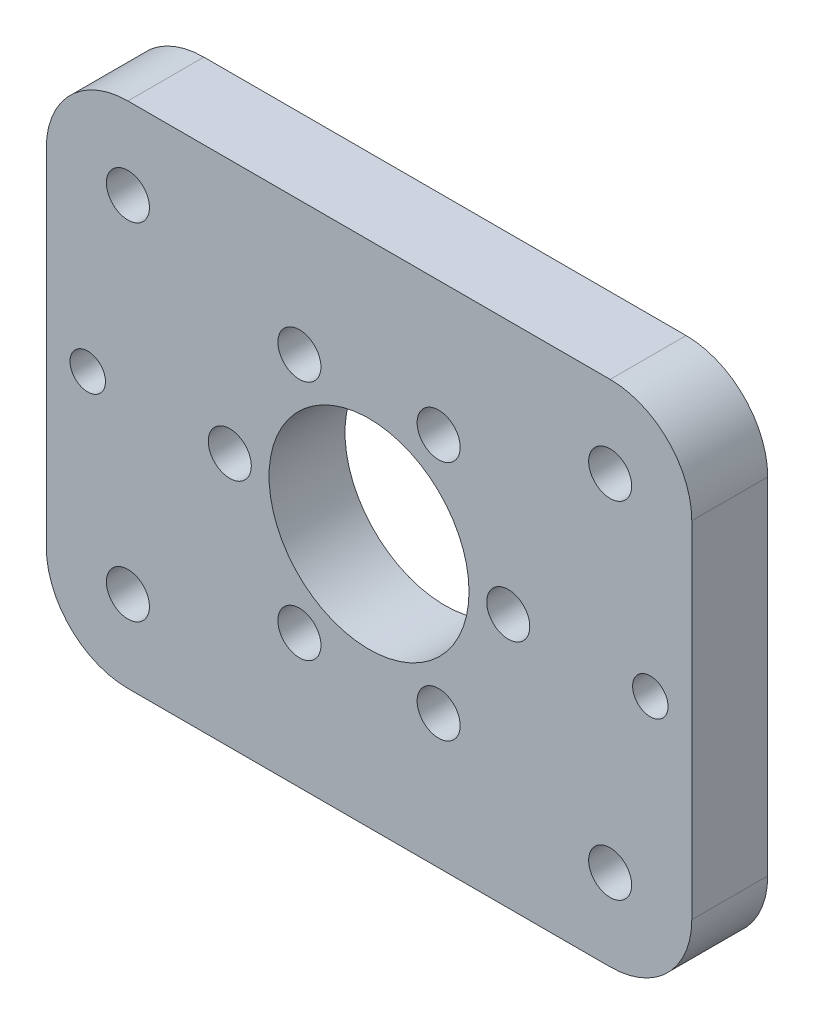
ISO-10303-21;
HEADER;
FILE_DESCRIPTION(('STEP AP214'),'2;1');
FILE_NAME('part.step','',(''),(''),'','','');
FILE_SCHEMA(('AUTOMOTIVE_DESIGN { 1 0 10303 214 1 1 1 1 }'));
ENDSEC;
DATA;
#1=APPLICATION_CONTEXT('core data for automotive mechanical design processes');
#2=APPLICATION_PROTOCOL_DEFINITION('international standard','automotive_design',2000,#1);
#3=PRODUCT_CONTEXT('',#1,'mechanical');
#4=PRODUCT('Part','Part','',(#3));
#5=PRODUCT_RELATED_PRODUCT_CATEGORY('part','',(#4));
#6=PRODUCT_DEFINITION_FORMATION('','',#4);
#7=PRODUCT_DEFINITION_CONTEXT('part definition',#1,'design');
#8=PRODUCT_DEFINITION('design','',#6,#7);
#9=PRODUCT_DEFINITION_SHAPE('','',#8);
#10=(LENGTH_UNIT() NAMED_UNIT(*) SI_UNIT(.MILLI.,.METRE.));
#11=(NAMED_UNIT(*) PLANE_ANGLE_UNIT() SI_UNIT($,.RADIAN.));
#12=(NAMED_UNIT(*) SI_UNIT($,.STERADIAN.) SOLID_ANGLE_UNIT());
#13=UNCERTAINTY_MEASURE_WITH_UNIT(LENGTH_MEASURE(1.E-05),#10,'distance_accuracy_value','');
#14=(GEOMETRIC_REPRESENTATION_CONTEXT(3) GLOBAL_UNCERTAINTY_ASSIGNED_CONTEXT((#13)) GLOBAL_UNIT_ASSIGNED_CONTEXT((#10,
#11,#12)) REPRESENTATION_CONTEXT('',''));
#15=CARTESIAN_POINT('',(0.,0.,0.));
#16=DIRECTION('',(0.,0.,1.));
#17=DIRECTION('',(1.,0.,0.));
#18=AXIS2_PLACEMENT_3D('',#15,#16,#17);
#19=CARTESIAN_POINT('',(-25.4,-20.,6.));
#20=DIRECTION('',(0.,0.,1.));
#21=DIRECTION('',(1.,0.,0.));
#22=AXIS2_PLACEMENT_3D('',#19,#20,#21);
#23=PLANE('',#22);
#24=CARTESIAN_POINT('',(5.50000000000001,9.52627944162883,6.));
#25=DIRECTION('',(0.,0.,1.));
#26=DIRECTION('',(1.,0.,0.));
#27=AXIS2_PLACEMENT_3D('',#24,#25,#26);
#28=CIRCLE('',#27,1.7);
#29=CARTESIAN_POINT('',(7.2,9.52627944162883,6.));
#30=VERTEX_POINT('',#29);
#31=EDGE_CURVE('E164',#30,#30,#28,.T.);
#32=ORIENTED_EDGE('',*,*,#31,.F.);
#33=EDGE_LOOP('',(#32));
#34=FACE_BOUND('',#33,.T.);
#35=CARTESIAN_POINT('',(-5.50000000000001,9.52627944162883,6.));
#36=DIRECTION('',(0.,0.,1.));
#37=DIRECTION('',(1.,0.,0.));
#38=AXIS2_PLACEMENT_3D('',#35,#36,#37);
#39=CIRCLE('',#38,1.7);
#40=CARTESIAN_POINT('',(-3.80000000000001,9.52627944162883,6.));
#41=VERTEX_POINT('',#40);
#42=EDGE_CURVE('E163',#41,#41,#39,.T.);
#43=ORIENTED_EDGE('',*,*,#42,.F.);
#44=EDGE_LOOP('',(#43));
#45=FACE_BOUND('',#44,.T.);
#46=CARTESIAN_POINT('',(-11.,0.,6.));
#47=DIRECTION('',(0.,0.,1.));
#48=DIRECTION('',(1.,0.,0.));
#49=AXIS2_PLACEMENT_3D('',#46,#47,#48);
#50=CIRCLE('',#49,1.7);
#51=CARTESIAN_POINT('',(-9.30000000000001,0.,6.));
#52=VERTEX_POINT('',#51);
#53=EDGE_CURVE('E170',#52,#52,#50,.T.);
#54=ORIENTED_EDGE('',*,*,#53,.F.);
#55=EDGE_LOOP('',(#54));
#56=FACE_BOUND('',#55,.T.);
#57=CARTESIAN_POINT('',(-5.5,-9.52627944162883,6.));
#58=DIRECTION('',(0.,0.,1.));
#59=DIRECTION('',(1.,0.,0.));
#60=AXIS2_PLACEMENT_3D('',#57,#58,#59);
#61=CIRCLE('',#60,1.7);
#62=CARTESIAN_POINT('',(-3.8,-9.52627944162883,6.));
#63=VERTEX_POINT('',#62);
#64=EDGE_CURVE('E176',#63,#63,#61,.T.);
#65=ORIENTED_EDGE('',*,*,#64,.F.);
#66=EDGE_LOOP('',(#65));
#67=FACE_BOUND('',#66,.T.);
#68=CARTESIAN_POINT('',(5.5,-9.52627944162883,6.));
#69=DIRECTION('',(0.,0.,1.));
#70=DIRECTION('',(1.,0.,0.));
#71=AXIS2_PLACEMENT_3D('',#68,#69,#70);
#72=CIRCLE('',#71,1.7);
#73=CARTESIAN_POINT('',(7.2,-9.52627944162883,6.));
#74=VERTEX_POINT('',#73);
#75=EDGE_CURVE('E182',#74,#74,#72,.T.);
#76=ORIENTED_EDGE('',*,*,#75,.F.);
#77=EDGE_LOOP('',(#76));
#78=FACE_BOUND('',#77,.T.);
#79=CARTESIAN_POINT('',(11.,0.,6.));
#80=DIRECTION('',(0.,0.,1.));
#81=DIRECTION('',(1.,0.,0.));
#82=AXIS2_PLACEMENT_3D('',#79,#80,#81);
#83=CIRCLE('',#82,1.7);
#84=CARTESIAN_POINT('',(12.7,0.,6.));
#85=VERTEX_POINT('',#84);
#86=EDGE_CURVE('E188',#85,#85,#83,.T.);
#87=ORIENTED_EDGE('',*,*,#86,.F.);
#88=EDGE_LOOP('',(#87));
#89=FACE_BOUND('',#88,.T.);
#90=CARTESIAN_POINT('',(19.05,13.65,6.));
#91=DIRECTION('',(0.,0.,1.));
#92=DIRECTION('',(1.,0.,0.));
#93=AXIS2_PLACEMENT_3D('',#90,#91,#92);
#94=CIRCLE('',#93,1.7);
#95=CARTESIAN_POINT('',(20.75,13.65,6.));
#96=VERTEX_POINT('',#95);
#97=EDGE_CURVE('E194',#96,#96,#94,.T.);
#98=ORIENTED_EDGE('',*,*,#97,.F.);
#99=EDGE_LOOP('',(#98));
#100=FACE_BOUND('',#99,.T.);
#101=CARTESIAN_POINT('',(19.05,-13.65,6.));
#102=DIRECTION('',(0.,0.,1.));
#103=DIRECTION('',(1.,0.,0.));
#104=AXIS2_PLACEMENT_3D('',#101,#102,#103);
#105=CIRCLE('',#104,1.7);
#106=CARTESIAN_POINT('',(20.75,-13.65,6.));
#107=VERTEX_POINT('',#106);
#108=EDGE_CURVE('E200',#107,#107,#105,.T.);
#109=ORIENTED_EDGE('',*,*,#108,.F.);
#110=EDGE_LOOP('',(#109));
#111=FACE_BOUND('',#110,.T.);
#112=CARTESIAN_POINT('',(-19.05,-13.65,6.));
#113=DIRECTION('',(0.,0.,1.));
#114=DIRECTION('',(1.,0.,0.));
#115=AXIS2_PLACEMENT_3D('',#112,#113,#114);
#116=CIRCLE('',#115,1.7);
#117=CARTESIAN_POINT('',(-17.35,-13.65,6.));
#118=VERTEX_POINT('',#117);
#119=EDGE_CURVE('E37',#118,#118,#116,.T.);
#120=ORIENTED_EDGE('',*,*,#119,.F.);
#121=EDGE_LOOP('',(#120));
#122=FACE_BOUND('',#121,.T.);
#123=CARTESIAN_POINT('',(-19.05,13.65,6.));
#124=DIRECTION('',(0.,0.,1.));
#125=DIRECTION('',(1.,0.,0.));
#126=AXIS2_PLACEMENT_3D('',#123,#124,#125);
#127=CIRCLE('',#126,1.7);
#128=CARTESIAN_POINT('',(-17.35,13.65,6.));
#129=VERTEX_POINT('',#128);
#130=EDGE_CURVE('E212',#129,#129,#127,.T.);
#131=ORIENTED_EDGE('',*,*,#130,.F.);
#132=EDGE_LOOP('',(#131));
#133=FACE_BOUND('',#132,.T.);
#134=CARTESIAN_POINT('',(-22.225,1.56125112837913E-13,6.));
#135=DIRECTION('',(0.,0.,1.));
#136=DIRECTION('',(1.,0.,0.));
#137=AXIS2_PLACEMENT_3D('',#134,#135,#136);
#138=CIRCLE('',#137,1.4);
#139=CARTESIAN_POINT('',(-20.825,1.56125112837913E-13,6.));
#140=VERTEX_POINT('',#139);
#141=EDGE_CURVE('E211',#140,#140,#138,.T.);
#142=ORIENTED_EDGE('',*,*,#141,.F.);
#143=EDGE_LOOP('',(#142));
#144=FACE_BOUND('',#143,.T.);
#145=CARTESIAN_POINT('',(22.225,0.,6.));
#146=DIRECTION('',(0.,0.,1.));
#147=DIRECTION('',(1.,0.,0.));
#148=AXIS2_PLACEMENT_3D('',#145,#146,#147);
#149=CIRCLE('',#148,1.4);
#150=CARTESIAN_POINT('',(23.625,0.,6.));
#151=VERTEX_POINT('',#150);
#152=EDGE_CURVE('E219',#151,#151,#149,.T.);
#153=ORIENTED_EDGE('',*,*,#152,.F.);
#154=EDGE_LOOP('',(#153));
#155=FACE_BOUND('',#154,.T.);
#156=DIRECTION('',(0.,-1.,0.));
#157=VECTOR('',#156,1.);
#158=CARTESIAN_POINT('',(-25.5,20.,6.));
#159=LINE('',#158,#157);
#160=CARTESIAN_POINT('',(-25.5,13.65,6.));
#161=VERTEX_POINT('',#160);
#162=CARTESIAN_POINT('',(-25.5,-13.65,6.));
#163=VERTEX_POINT('',#162);
#164=EDGE_CURVE('E113',#161,#163,#159,.T.);
#165=ORIENTED_EDGE('',*,*,#164,.T.);
#166=CARTESIAN_POINT('',(-19.05,-13.65,6.));
#167=DIRECTION('',(0.,0.,1.));
#168=DIRECTION('',(1.,0.,0.));
#169=AXIS2_PLACEMENT_3D('',#166,#167,#168);
#170=CIRCLE('',#169,6.45);
#171=CARTESIAN_POINT('',(-19.05,-20.1,6.));
#172=VERTEX_POINT('',#171);
#173=EDGE_CURVE('E142',#163,#172,#170,.T.);
#174=ORIENTED_EDGE('',*,*,#173,.T.);
#175=DIRECTION('',(1.,0.,0.));
#176=VECTOR('',#175,1.);
#177=CARTESIAN_POINT('',(-25.4,-20.1,6.));
#178=LINE('',#177,#176);
#179=CARTESIAN_POINT('',(19.05,-20.1,6.));
#180=VERTEX_POINT('',#179);
#181=EDGE_CURVE('E141',#172,#180,#178,.T.);
#182=ORIENTED_EDGE('',*,*,#181,.T.);
#183=CARTESIAN_POINT('',(19.05,-13.65,6.));
#184=DIRECTION('',(0.,0.,1.));
#185=DIRECTION('',(1.,0.,0.));
#186=AXIS2_PLACEMENT_3D('',#183,#184,#185);
#187=CIRCLE('',#186,6.45);
#188=CARTESIAN_POINT('',(25.5,-13.65,6.));
#189=VERTEX_POINT('',#188);
#190=EDGE_CURVE('E145',#180,#189,#187,.T.);
#191=ORIENTED_EDGE('',*,*,#190,.T.);
#192=DIRECTION('',(0.,1.,0.));
#193=VECTOR('',#192,1.);
#194=CARTESIAN_POINT('',(25.5,20.,6.));
#195=LINE('',#194,#193);
#196=CARTESIAN_POINT('',(25.5,13.65,6.));
#197=VERTEX_POINT('',#196);
#198=EDGE_CURVE('E148',#189,#197,#195,.T.);
#199=ORIENTED_EDGE('',*,*,#198,.T.);
#200=CARTESIAN_POINT('',(19.05,13.65,6.));
#201=DIRECTION('',(0.,0.,1.));
#202=DIRECTION('',(1.,0.,0.));
#203=AXIS2_PLACEMENT_3D('',#200,#201,#202);
#204=CIRCLE('',#203,6.45);
#205=CARTESIAN_POINT('',(19.05,20.1,6.));
#206=VERTEX_POINT('',#205);
#207=EDGE_CURVE('E150',#197,#206,#204,.T.);
#208=ORIENTED_EDGE('',*,*,#207,.T.);
#209=DIRECTION('',(-1.,0.,0.));
#210=VECTOR('',#209,1.);
#211=CARTESIAN_POINT('',(25.4,20.1,6.));
#212=LINE('',#211,#210);
#213=CARTESIAN_POINT('',(-19.05,20.1,6.));
#214=VERTEX_POINT('',#213);
#215=EDGE_CURVE('E153',#206,#214,#212,.T.);
#216=ORIENTED_EDGE('',*,*,#215,.T.);
#217=CARTESIAN_POINT('',(-19.05,13.65,6.));
#218=DIRECTION('',(0.,0.,1.));
#219=DIRECTION('',(1.,0.,0.));
#220=AXIS2_PLACEMENT_3D('',#217,#218,#219);
#221=CIRCLE('',#220,6.45);
#222=EDGE_CURVE('E155',#214,#161,#221,.T.);
#223=ORIENTED_EDGE('',*,*,#222,.T.);
#224=EDGE_LOOP('',(#165,#174,#182,#191,#199,#208,#216,#223));
#225=FACE_BOUND('',#224,.T.);
#226=CARTESIAN_POINT('',(0.,0.,6.));
#227=DIRECTION('',(0.,0.,1.));
#228=DIRECTION('',(1.,0.,0.));
#229=AXIS2_PLACEMENT_3D('',#226,#227,#228);
#230=CIRCLE('',#229,7.9);
#231=CARTESIAN_POINT('',(7.9,0.,6.));
#232=VERTEX_POINT('',#231);
#233=EDGE_CURVE('E121',#232,#232,#230,.T.);
#234=ORIENTED_EDGE('',*,*,#233,.F.);
#235=EDGE_LOOP('',(#234));
#236=FACE_BOUND('',#235,.T.);
#237=ADVANCED_FACE('F33',(#34,#45,#56,#67,#78,#89,#100,#111,#122,#133,#144,#155,#225,#236),#23,.T.);
#238=CARTESIAN_POINT('',(-25.4,-20.,0.));
#239=DIRECTION('',(0.,0.,1.));
#240=DIRECTION('',(1.,0.,0.));
#241=AXIS2_PLACEMENT_3D('',#238,#239,#240);
#242=PLANE('',#241);
#243=CARTESIAN_POINT('',(5.50000000000001,9.52627944162883,0.));
#244=DIRECTION('',(0.,0.,1.));
#245=DIRECTION('',(1.,0.,0.));
#246=AXIS2_PLACEMENT_3D('',#243,#244,#245);
#247=CIRCLE('',#246,1.7);
#248=CARTESIAN_POINT('',(7.2,9.52627944162883,0.));
#249=VERTEX_POINT('',#248);
#250=EDGE_CURVE('E160',#249,#249,#247,.T.);
#251=ORIENTED_EDGE('',*,*,#250,.T.);
#252=EDGE_LOOP('',(#251));
#253=FACE_BOUND('',#252,.T.);
#254=CARTESIAN_POINT('',(-5.50000000000001,9.52627944162883,0.));
#255=DIRECTION('',(0.,0.,1.));
#256=DIRECTION('',(1.,0.,0.));
#257=AXIS2_PLACEMENT_3D('',#254,#255,#256);
#258=CIRCLE('',#257,1.7);
#259=CARTESIAN_POINT('',(-3.80000000000001,9.52627944162883,0.));
#260=VERTEX_POINT('',#259);
#261=EDGE_CURVE('E167',#260,#260,#258,.T.);
#262=ORIENTED_EDGE('',*,*,#261,.T.);
#263=EDGE_LOOP('',(#262));
#264=FACE_BOUND('',#263,.T.);
#265=CARTESIAN_POINT('',(-11.,0.,0.));
#266=DIRECTION('',(0.,0.,1.));
#267=DIRECTION('',(1.,0.,0.));
#268=AXIS2_PLACEMENT_3D('',#265,#266,#267);
#269=CIRCLE('',#268,1.7);
#270=CARTESIAN_POINT('',(-9.30000000000001,0.,0.));
#271=VERTEX_POINT('',#270);
#272=EDGE_CURVE('E173',#271,#271,#269,.T.);
#273=ORIENTED_EDGE('',*,*,#272,.T.);
#274=EDGE_LOOP('',(#273));
#275=FACE_BOUND('',#274,.T.);
#276=CARTESIAN_POINT('',(-5.5,-9.52627944162883,0.));
#277=DIRECTION('',(0.,0.,1.));
#278=DIRECTION('',(1.,0.,0.));
#279=AXIS2_PLACEMENT_3D('',#276,#277,#278);
#280=CIRCLE('',#279,1.7);
#281=CARTESIAN_POINT('',(-3.8,-9.52627944162883,0.));
#282=VERTEX_POINT('',#281);
#283=EDGE_CURVE('E179',#282,#282,#280,.T.);
#284=ORIENTED_EDGE('',*,*,#283,.T.);
#285=EDGE_LOOP('',(#284));
#286=FACE_BOUND('',#285,.T.);
#287=CARTESIAN_POINT('',(5.5,-9.52627944162883,0.));
#288=DIRECTION('',(0.,0.,1.));
#289=DIRECTION('',(1.,0.,0.));
#290=AXIS2_PLACEMENT_3D('',#287,#288,#289);
#291=CIRCLE('',#290,1.7);
#292=CARTESIAN_POINT('',(7.2,-9.52627944162883,0.));
#293=VERTEX_POINT('',#292);
#294=EDGE_CURVE('E185',#293,#293,#291,.T.);
#295=ORIENTED_EDGE('',*,*,#294,.T.);
#296=EDGE_LOOP('',(#295));
#297=FACE_BOUND('',#296,.T.);
#298=CARTESIAN_POINT('',(11.,0.,0.));
#299=DIRECTION('',(0.,0.,1.));
#300=DIRECTION('',(1.,0.,0.));
#301=AXIS2_PLACEMENT_3D('',#298,#299,#300);
#302=CIRCLE('',#301,1.7);
#303=CARTESIAN_POINT('',(12.7,0.,0.));
#304=VERTEX_POINT('',#303);
#305=EDGE_CURVE('E191',#304,#304,#302,.T.);
#306=ORIENTED_EDGE('',*,*,#305,.T.);
#307=EDGE_LOOP('',(#306));
#308=FACE_BOUND('',#307,.T.);
#309=CARTESIAN_POINT('',(19.05,13.65,0.));
#310=DIRECTION('',(0.,0.,1.));
#311=DIRECTION('',(1.,0.,0.));
#312=AXIS2_PLACEMENT_3D('',#309,#310,#311);
#313=CIRCLE('',#312,1.7);
#314=CARTESIAN_POINT('',(20.75,13.65,0.));
#315=VERTEX_POINT('',#314);
#316=EDGE_CURVE('E197',#315,#315,#313,.T.);
#317=ORIENTED_EDGE('',*,*,#316,.T.);
#318=EDGE_LOOP('',(#317));
#319=FACE_BOUND('',#318,.T.);
#320=CARTESIAN_POINT('',(19.05,-13.65,0.));
#321=DIRECTION('',(0.,0.,1.));
#322=DIRECTION('',(1.,0.,0.));
#323=AXIS2_PLACEMENT_3D('',#320,#321,#322);
#324=CIRCLE('',#323,1.7);
#325=CARTESIAN_POINT('',(20.75,-13.65,0.));
#326=VERTEX_POINT('',#325);
#327=EDGE_CURVE('E203',#326,#326,#324,.T.);
#328=ORIENTED_EDGE('',*,*,#327,.T.);
#329=EDGE_LOOP('',(#328));
#330=FACE_BOUND('',#329,.T.);
#331=CARTESIAN_POINT('',(-19.05,-13.65,0.));
#332=DIRECTION('',(0.,0.,1.));
#333=DIRECTION('',(1.,0.,0.));
#334=AXIS2_PLACEMENT_3D('',#331,#332,#333);
#335=CIRCLE('',#334,1.7);
#336=CARTESIAN_POINT('',(-17.35,-13.65,0.));
#337=VERTEX_POINT('',#336);
#338=EDGE_CURVE('E215',#337,#337,#335,.T.);
#339=ORIENTED_EDGE('',*,*,#338,.T.);
#340=EDGE_LOOP('',(#339));
#341=FACE_BOUND('',#340,.T.);
#342=CARTESIAN_POINT('',(-19.05,13.65,0.));
#343=DIRECTION('',(0.,0.,1.));
#344=DIRECTION('',(1.,0.,0.));
#345=AXIS2_PLACEMENT_3D('',#342,#343,#344);
#346=CIRCLE('',#345,1.7);
#347=CARTESIAN_POINT('',(-17.35,13.65,0.));
#348=VERTEX_POINT('',#347);
#349=EDGE_CURVE('E208',#348,#348,#346,.T.);
#350=ORIENTED_EDGE('',*,*,#349,.T.);
#351=EDGE_LOOP('',(#350));
#352=FACE_BOUND('',#351,.T.);
#353=CARTESIAN_POINT('',(-22.225,1.56125112837913E-13,0.));
#354=DIRECTION('',(0.,0.,1.));
#355=DIRECTION('',(1.,0.,0.));
#356=AXIS2_PLACEMENT_3D('',#353,#354,#355);
#357=CIRCLE('',#356,1.4);
#358=CARTESIAN_POINT('',(-20.825,1.56125112837913E-13,0.));
#359=VERTEX_POINT('',#358);
#360=EDGE_CURVE('E216',#359,#359,#357,.T.);
#361=ORIENTED_EDGE('',*,*,#360,.T.);
#362=EDGE_LOOP('',(#361));
#363=FACE_BOUND('',#362,.T.);
#364=CARTESIAN_POINT('',(22.225,0.,0.));
#365=DIRECTION('',(0.,0.,1.));
#366=DIRECTION('',(1.,0.,0.));
#367=AXIS2_PLACEMENT_3D('',#364,#365,#366);
#368=CIRCLE('',#367,1.4);
#369=CARTESIAN_POINT('',(23.625,0.,0.));
#370=VERTEX_POINT('',#369);
#371=EDGE_CURVE('E222',#370,#370,#368,.T.);
#372=ORIENTED_EDGE('',*,*,#371,.T.);
#373=EDGE_LOOP('',(#372));
#374=FACE_BOUND('',#373,.T.);
#375=DIRECTION('',(1.,0.,0.));
#376=VECTOR('',#375,1.);
#377=CARTESIAN_POINT('',(-25.4,-20.1,0.));
#378=LINE('',#377,#376);
#379=CARTESIAN_POINT('',(-19.05,-20.1,0.));
#380=VERTEX_POINT('',#379);
#381=CARTESIAN_POINT('',(19.05,-20.1,0.));
#382=VERTEX_POINT('',#381);
#383=EDGE_CURVE('E120',#380,#382,#378,.T.);
#384=ORIENTED_EDGE('',*,*,#383,.F.);
#385=CARTESIAN_POINT('',(-19.05,-13.65,0.));
#386=DIRECTION('',(0.,0.,1.));
#387=DIRECTION('',(1.,0.,0.));
#388=AXIS2_PLACEMENT_3D('',#385,#386,#387);
#389=CIRCLE('',#388,6.45);
#390=CARTESIAN_POINT('',(-25.5,-13.65,0.));
#391=VERTEX_POINT('',#390);
#392=EDGE_CURVE('E115',#380,#391,#389,.F.);
#393=ORIENTED_EDGE('',*,*,#392,.T.);
#394=DIRECTION('',(0.,-1.,0.));
#395=VECTOR('',#394,1.);
#396=CARTESIAN_POINT('',(-25.5,20.,0.));
#397=LINE('',#396,#395);
#398=CARTESIAN_POINT('',(-25.5,13.65,0.));
#399=VERTEX_POINT('',#398);
#400=EDGE_CURVE('E110',#399,#391,#397,.T.);
#401=ORIENTED_EDGE('',*,*,#400,.F.);
#402=CARTESIAN_POINT('',(-19.05,13.65,0.));
#403=DIRECTION('',(0.,0.,1.));
#404=DIRECTION('',(1.,0.,0.));
#405=AXIS2_PLACEMENT_3D('',#402,#403,#404);
#406=CIRCLE('',#405,6.45);
#407=CARTESIAN_POINT('',(-19.05,20.1,0.));
#408=VERTEX_POINT('',#407);
#409=EDGE_CURVE('E95',#399,#408,#406,.F.);
#410=ORIENTED_EDGE('',*,*,#409,.T.);
#411=DIRECTION('',(-1.,0.,0.));
#412=VECTOR('',#411,1.);
#413=CARTESIAN_POINT('',(25.4,20.1,0.));
#414=LINE('',#413,#412);
#415=CARTESIAN_POINT('',(19.05,20.1,0.));
#416=VERTEX_POINT('',#415);
#417=EDGE_CURVE('E132',#416,#408,#414,.T.);
#418=ORIENTED_EDGE('',*,*,#417,.F.);
#419=CARTESIAN_POINT('',(19.05,13.65,0.));
#420=DIRECTION('',(0.,0.,1.));
#421=DIRECTION('',(1.,0.,0.));
#422=AXIS2_PLACEMENT_3D('',#419,#420,#421);
#423=CIRCLE('',#422,6.45);
#424=CARTESIAN_POINT('',(25.5,13.65,0.));
#425=VERTEX_POINT('',#424);
#426=EDGE_CURVE('E103',#416,#425,#423,.F.);
#427=ORIENTED_EDGE('',*,*,#426,.T.);
#428=DIRECTION('',(0.,1.,0.));
#429=VECTOR('',#428,1.);
#430=CARTESIAN_POINT('',(25.5,20.,0.));
#431=LINE('',#430,#429);
#432=CARTESIAN_POINT('',(25.5,-13.65,0.));
#433=VERTEX_POINT('',#432);
#434=EDGE_CURVE('E124',#433,#425,#431,.T.);
#435=ORIENTED_EDGE('',*,*,#434,.F.);
#436=CARTESIAN_POINT('',(19.05,-13.65,0.));
#437=DIRECTION('',(0.,0.,1.));
#438=DIRECTION('',(1.,0.,0.));
#439=AXIS2_PLACEMENT_3D('',#436,#437,#438);
#440=CIRCLE('',#439,6.45);
#441=EDGE_CURVE('E135',#433,#382,#440,.F.);
#442=ORIENTED_EDGE('',*,*,#441,.T.);
#443=EDGE_LOOP('',(#384,#393,#401,#410,#418,#427,#435,#442));
#444=FACE_BOUND('',#443,.T.);
#445=CARTESIAN_POINT('',(0.,0.,0.));
#446=DIRECTION('',(0.,0.,1.));
#447=DIRECTION('',(1.,0.,0.));
#448=AXIS2_PLACEMENT_3D('',#445,#446,#447);
#449=CIRCLE('',#448,7.9);
#450=CARTESIAN_POINT('',(7.9,0.,0.));
#451=VERTEX_POINT('',#450);
#452=EDGE_CURVE('E127',#451,#451,#449,.T.);
#453=ORIENTED_EDGE('',*,*,#452,.T.);
#454=EDGE_LOOP('',(#453));
#455=FACE_BOUND('',#454,.T.);
#456=ADVANCED_FACE('F118',(#253,#264,#275,#286,#297,#308,#319,#330,#341,#352,#363,#374,#444,
#455),#242,.F.);
#457=CARTESIAN_POINT('',(-25.5,20.,6.));
#458=DIRECTION('',(1.,0.,0.));
#459=DIRECTION('',(0.,1.,0.));
#460=AXIS2_PLACEMENT_3D('',#457,#458,#459);
#461=PLANE('',#460);
#462=ORIENTED_EDGE('',*,*,#400,.T.);
#463=DIRECTION('',(0.,0.,1.));
#464=VECTOR('',#463,1.);
#465=CARTESIAN_POINT('',(-25.5,-13.65,6.));
#466=LINE('',#465,#464);
#467=EDGE_CURVE('E114',#391,#163,#466,.T.);
#468=ORIENTED_EDGE('',*,*,#467,.T.);
#469=ORIENTED_EDGE('',*,*,#164,.F.);
#470=DIRECTION('',(0.,0.,1.));
#471=VECTOR('',#470,1.);
#472=CARTESIAN_POINT('',(-25.5,13.65,6.));
#473=LINE('',#472,#471);
#474=EDGE_CURVE('E99',#161,#399,#473,.F.);
#475=ORIENTED_EDGE('',*,*,#474,.T.);
#476=EDGE_LOOP('',(#462,#468,#469,#475));
#477=FACE_BOUND('',#476,.T.);
#478=ADVANCED_FACE('F109',(#477),#461,.F.);
#479=CARTESIAN_POINT('',(-25.4,-20.1,6.));
#480=DIRECTION('',(0.,1.,0.));
#481=DIRECTION('',(-1.,0.,0.));
#482=AXIS2_PLACEMENT_3D('',#479,#480,#481);
#483=PLANE('',#482);
#484=ORIENTED_EDGE('',*,*,#181,.F.);
#485=DIRECTION('',(0.,0.,1.));
#486=VECTOR('',#485,1.);
#487=CARTESIAN_POINT('',(-19.05,-20.1,6.));
#488=LINE('',#487,#486);
#489=EDGE_CURVE('E104',#172,#380,#488,.F.);
#490=ORIENTED_EDGE('',*,*,#489,.T.);
#491=ORIENTED_EDGE('',*,*,#383,.T.);
#492=DIRECTION('',(0.,0.,1.));
#493=VECTOR('',#492,1.);
#494=CARTESIAN_POINT('',(19.05,-20.1,6.));
#495=LINE('',#494,#493);
#496=EDGE_CURVE('E157',#382,#180,#495,.T.);
#497=ORIENTED_EDGE('',*,*,#496,.T.);
#498=EDGE_LOOP('',(#484,#490,#491,#497));
#499=FACE_BOUND('',#498,.T.);
#500=ADVANCED_FACE('F263',(#499),#483,.F.);
#501=CARTESIAN_POINT('',(25.5,20.,6.));
#502=DIRECTION('',(-1.,0.,0.));
#503=DIRECTION('',(0.,-1.,0.));
#504=AXIS2_PLACEMENT_3D('',#501,#502,#503);
#505=PLANE('',#504);
#506=ORIENTED_EDGE('',*,*,#198,.F.);
#507=DIRECTION('',(0.,0.,1.));
#508=VECTOR('',#507,1.);
#509=CARTESIAN_POINT('',(25.5,-13.65,6.));
#510=LINE('',#509,#508);
#511=EDGE_CURVE('E340',#189,#433,#510,.F.);
#512=ORIENTED_EDGE('',*,*,#511,.T.);
#513=ORIENTED_EDGE('',*,*,#434,.T.);
#514=DIRECTION('',(0.,0.,1.));
#515=VECTOR('',#514,1.);
#516=CARTESIAN_POINT('',(25.5,13.65,6.));
#517=LINE('',#516,#515);
#518=EDGE_CURVE('E144',#425,#197,#517,.T.);
#519=ORIENTED_EDGE('',*,*,#518,.T.);
#520=EDGE_LOOP('',(#506,#512,#513,#519));
#521=FACE_BOUND('',#520,.T.);
#522=ADVANCED_FACE('F273',(#521),#505,.F.);
#523=CARTESIAN_POINT('',(25.4,20.1,6.));
#524=DIRECTION('',(0.,-1.,0.));
#525=DIRECTION('',(0.,0.,-1.));
#526=AXIS2_PLACEMENT_3D('',#523,#524,#525);
#527=PLANE('',#526);
#528=ORIENTED_EDGE('',*,*,#215,.F.);
#529=DIRECTION('',(0.,0.,-1.));
#530=VECTOR('',#529,1.);
#531=CARTESIAN_POINT('',(19.05,20.1,6.));
#532=LINE('',#531,#530);
#533=EDGE_CURVE('E12',#206,#416,#532,.T.);
#534=ORIENTED_EDGE('',*,*,#533,.T.);
#535=ORIENTED_EDGE('',*,*,#417,.T.);
#536=DIRECTION('',(0.,0.,-1.));
#537=VECTOR('',#536,1.);
#538=CARTESIAN_POINT('',(-19.05,20.1,6.));
#539=LINE('',#538,#537);
#540=EDGE_CURVE('E43',#408,#214,#539,.F.);
#541=ORIENTED_EDGE('',*,*,#540,.T.);
#542=EDGE_LOOP('',(#528,#534,#535,#541));
#543=FACE_BOUND('',#542,.T.);
#544=ADVANCED_FACE('F254',(#543),#527,.F.);
#545=CARTESIAN_POINT('',(0.,0.,6.));
#546=DIRECTION('',(0.,0.,-1.));
#547=DIRECTION('',(-1.,0.,0.));
#548=AXIS2_PLACEMENT_3D('',#545,#546,#547);
#549=CYLINDRICAL_SURFACE('',#548,7.9);
#550=ORIENTED_EDGE('',*,*,#233,.T.);
#551=EDGE_LOOP('',(#550));
#552=FACE_BOUND('',#551,.T.);
#553=ORIENTED_EDGE('',*,*,#452,.F.);
#554=EDGE_LOOP('',(#553));
#555=FACE_BOUND('',#554,.T.);
#556=ADVANCED_FACE('F250',(#552,#555),#549,.F.);
#557=CARTESIAN_POINT('',(-19.05,-13.65,6.));
#558=DIRECTION('',(0.,0.,-1.));
#559=DIRECTION('',(-1.,0.,0.));
#560=AXIS2_PLACEMENT_3D('',#557,#558,#559);
#561=CYLINDRICAL_SURFACE('',#560,6.45);
#562=ORIENTED_EDGE('',*,*,#173,.F.);
#563=ORIENTED_EDGE('',*,*,#467,.F.);
#564=ORIENTED_EDGE('',*,*,#392,.F.);
#565=ORIENTED_EDGE('',*,*,#489,.F.);
#566=EDGE_LOOP('',(#562,#563,#564,#565));
#567=FACE_BOUND('',#566,.T.);
#568=ADVANCED_FACE('F253',(#567),#561,.T.);
#569=CARTESIAN_POINT('',(19.05,-13.65,6.));
#570=DIRECTION('',(0.,0.,-1.));
#571=DIRECTION('',(-1.,0.,0.));
#572=AXIS2_PLACEMENT_3D('',#569,#570,#571);
#573=CYLINDRICAL_SURFACE('',#572,6.45);
#574=ORIENTED_EDGE('',*,*,#190,.F.);
#575=ORIENTED_EDGE('',*,*,#496,.F.);
#576=ORIENTED_EDGE('',*,*,#441,.F.);
#577=ORIENTED_EDGE('',*,*,#511,.F.);
#578=EDGE_LOOP('',(#574,#575,#576,#577));
#579=FACE_BOUND('',#578,.T.);
#580=ADVANCED_FACE('F35',(#579),#573,.T.);
#581=CARTESIAN_POINT('',(19.05,13.65,6.));
#582=DIRECTION('',(0.,0.,-1.));
#583=DIRECTION('',(-1.,0.,0.));
#584=AXIS2_PLACEMENT_3D('',#581,#582,#583);
#585=CYLINDRICAL_SURFACE('',#584,6.45);
#586=ORIENTED_EDGE('',*,*,#207,.F.);
#587=ORIENTED_EDGE('',*,*,#518,.F.);
#588=ORIENTED_EDGE('',*,*,#426,.F.);
#589=ORIENTED_EDGE('',*,*,#533,.F.);
#590=EDGE_LOOP('',(#586,#587,#588,#589));
#591=FACE_BOUND('',#590,.T.);
#592=ADVANCED_FACE('F270',(#591),#585,.T.);
#593=CARTESIAN_POINT('',(-19.05,13.65,6.));
#594=DIRECTION('',(0.,0.,-1.));
#595=DIRECTION('',(-1.,0.,0.));
#596=AXIS2_PLACEMENT_3D('',#593,#594,#595);
#597=CYLINDRICAL_SURFACE('',#596,6.45);
#598=ORIENTED_EDGE('',*,*,#222,.F.);
#599=ORIENTED_EDGE('',*,*,#540,.F.);
#600=ORIENTED_EDGE('',*,*,#409,.F.);
#601=ORIENTED_EDGE('',*,*,#474,.F.);
#602=EDGE_LOOP('',(#598,#599,#600,#601));
#603=FACE_BOUND('',#602,.T.);
#604=ADVANCED_FACE('F98',(#603),#597,.T.);
#605=CARTESIAN_POINT('',(22.225,0.,0.));
#606=DIRECTION('',(0.,0.,1.));
#607=DIRECTION('',(1.,0.,0.));
#608=AXIS2_PLACEMENT_3D('',#605,#606,#607);
#609=CYLINDRICAL_SURFACE('',#608,1.4);
#610=ORIENTED_EDGE('',*,*,#371,.F.);
#611=EDGE_LOOP('',(#610));
#612=FACE_BOUND('',#611,.T.);
#613=ORIENTED_EDGE('',*,*,#152,.T.);
#614=EDGE_LOOP('',(#613));
#615=FACE_BOUND('',#614,.T.);
#616=ADVANCED_FACE('F269',(#612,#615),#609,.F.);
#617=CARTESIAN_POINT('',(-22.225,1.56125112837913E-13,0.));
#618=DIRECTION('',(0.,0.,1.));
#619=DIRECTION('',(1.,0.,0.));
#620=AXIS2_PLACEMENT_3D('',#617,#618,#619);
#621=CYLINDRICAL_SURFACE('',#620,1.4);
#622=ORIENTED_EDGE('',*,*,#360,.F.);
#623=EDGE_LOOP('',(#622));
#624=FACE_BOUND('',#623,.T.);
#625=ORIENTED_EDGE('',*,*,#141,.T.);
#626=EDGE_LOOP('',(#625));
#627=FACE_BOUND('',#626,.T.);
#628=ADVANCED_FACE('F290',(#624,#627),#621,.F.);
#629=CARTESIAN_POINT('',(-19.05,13.65,0.));
#630=DIRECTION('',(0.,0.,1.));
#631=DIRECTION('',(1.,0.,0.));
#632=AXIS2_PLACEMENT_3D('',#629,#630,#631);
#633=CYLINDRICAL_SURFACE('',#632,1.7);
#634=ORIENTED_EDGE('',*,*,#349,.F.);
#635=EDGE_LOOP('',(#634));
#636=FACE_BOUND('',#635,.T.);
#637=ORIENTED_EDGE('',*,*,#130,.T.);
#638=EDGE_LOOP('',(#637));
#639=FACE_BOUND('',#638,.T.);
#640=ADVANCED_FACE('F285',(#636,#639),#633,.F.);
#641=CARTESIAN_POINT('',(-19.05,-13.65,0.));
#642=DIRECTION('',(0.,0.,1.));
#643=DIRECTION('',(1.,0.,0.));
#644=AXIS2_PLACEMENT_3D('',#641,#642,#643);
#645=CYLINDRICAL_SURFACE('',#644,1.7);
#646=ORIENTED_EDGE('',*,*,#338,.F.);
#647=EDGE_LOOP('',(#646));
#648=FACE_BOUND('',#647,.T.);
#649=ORIENTED_EDGE('',*,*,#119,.T.);
#650=EDGE_LOOP('',(#649));
#651=FACE_BOUND('',#650,.T.);
#652=ADVANCED_FACE('F234',(#648,#651),#645,.F.);
#653=CARTESIAN_POINT('',(19.05,-13.65,0.));
#654=DIRECTION('',(0.,0.,1.));
#655=DIRECTION('',(1.,0.,0.));
#656=AXIS2_PLACEMENT_3D('',#653,#654,#655);
#657=CYLINDRICAL_SURFACE('',#656,1.7);
#658=ORIENTED_EDGE('',*,*,#327,.F.);
#659=EDGE_LOOP('',(#658));
#660=FACE_BOUND('',#659,.T.);
#661=ORIENTED_EDGE('',*,*,#108,.T.);
#662=EDGE_LOOP('',(#661));
#663=FACE_BOUND('',#662,.T.);
#664=ADVANCED_FACE('F284',(#660,#663),#657,.F.);
#665=CARTESIAN_POINT('',(19.05,13.65,0.));
#666=DIRECTION('',(0.,0.,1.));
#667=DIRECTION('',(1.,0.,0.));
#668=AXIS2_PLACEMENT_3D('',#665,#666,#667);
#669=CYLINDRICAL_SURFACE('',#668,1.7);
#670=ORIENTED_EDGE('',*,*,#316,.F.);
#671=EDGE_LOOP('',(#670));
#672=FACE_BOUND('',#671,.T.);
#673=ORIENTED_EDGE('',*,*,#97,.T.);
#674=EDGE_LOOP('',(#673));
#675=FACE_BOUND('',#674,.T.);
#676=ADVANCED_FACE('F300',(#672,#675),#669,.F.);
#677=CARTESIAN_POINT('',(11.,0.,0.));
#678=DIRECTION('',(0.,0.,1.));
#679=DIRECTION('',(1.,0.,0.));
#680=AXIS2_PLACEMENT_3D('',#677,#678,#679);
#681=CYLINDRICAL_SURFACE('',#680,1.7);
#682=ORIENTED_EDGE('',*,*,#305,.F.);
#683=EDGE_LOOP('',(#682));
#684=FACE_BOUND('',#683,.T.);
#685=ORIENTED_EDGE('',*,*,#86,.T.);
#686=EDGE_LOOP('',(#685));
#687=FACE_BOUND('',#686,.T.);
#688=ADVANCED_FACE('F304',(#684,#687),#681,.F.);
#689=CARTESIAN_POINT('',(5.5,-9.52627944162883,0.));
#690=DIRECTION('',(0.,0.,1.));
#691=DIRECTION('',(1.,0.,0.));
#692=AXIS2_PLACEMENT_3D('',#689,#690,#691);
#693=CYLINDRICAL_SURFACE('',#692,1.7);
#694=ORIENTED_EDGE('',*,*,#294,.F.);
#695=EDGE_LOOP('',(#694));
#696=FACE_BOUND('',#695,.T.);
#697=ORIENTED_EDGE('',*,*,#75,.T.);
#698=EDGE_LOOP('',(#697));
#699=FACE_BOUND('',#698,.T.);
#700=ADVANCED_FACE('F308',(#696,#699),#693,.F.);
#701=CARTESIAN_POINT('',(-5.5,-9.52627944162883,0.));
#702=DIRECTION('',(0.,0.,1.));
#703=DIRECTION('',(1.,0.,0.));
#704=AXIS2_PLACEMENT_3D('',#701,#702,#703);
#705=CYLINDRICAL_SURFACE('',#704,1.7);
#706=ORIENTED_EDGE('',*,*,#283,.F.);
#707=EDGE_LOOP('',(#706));
#708=FACE_BOUND('',#707,.T.);
#709=ORIENTED_EDGE('',*,*,#64,.T.);
#710=EDGE_LOOP('',(#709));
#711=FACE_BOUND('',#710,.T.);
#712=ADVANCED_FACE('F312',(#708,#711),#705,.F.);
#713=CARTESIAN_POINT('',(-11.,0.,0.));
#714=DIRECTION('',(0.,0.,1.));
#715=DIRECTION('',(1.,0.,0.));
#716=AXIS2_PLACEMENT_3D('',#713,#714,#715);
#717=CYLINDRICAL_SURFACE('',#716,1.7);
#718=ORIENTED_EDGE('',*,*,#272,.F.);
#719=EDGE_LOOP('',(#718));
#720=FACE_BOUND('',#719,.T.);
#721=ORIENTED_EDGE('',*,*,#53,.T.);
#722=EDGE_LOOP('',(#721));
#723=FACE_BOUND('',#722,.T.);
#724=ADVANCED_FACE('F316',(#720,#723),#717,.F.);
#725=CARTESIAN_POINT('',(-5.50000000000001,9.52627944162883,0.));
#726=DIRECTION('',(0.,0.,1.));
#727=DIRECTION('',(1.,0.,0.));
#728=AXIS2_PLACEMENT_3D('',#725,#726,#727);
#729=CYLINDRICAL_SURFACE('',#728,1.7);
#730=ORIENTED_EDGE('',*,*,#261,.F.);
#731=EDGE_LOOP('',(#730));
#732=FACE_BOUND('',#731,.T.);
#733=ORIENTED_EDGE('',*,*,#42,.T.);
#734=EDGE_LOOP('',(#733));
#735=FACE_BOUND('',#734,.T.);
#736=ADVANCED_FACE('F320',(#732,#735),#729,.F.);
#737=CARTESIAN_POINT('',(5.50000000000001,9.52627944162883,0.));
#738=DIRECTION('',(0.,0.,1.));
#739=DIRECTION('',(1.,0.,0.));
#740=AXIS2_PLACEMENT_3D('',#737,#738,#739);
#741=CYLINDRICAL_SURFACE('',#740,1.7);
#742=ORIENTED_EDGE('',*,*,#250,.F.);
#743=EDGE_LOOP('',(#742));
#744=FACE_BOUND('',#743,.T.);
#745=ORIENTED_EDGE('',*,*,#31,.T.);
#746=EDGE_LOOP('',(#745));
#747=FACE_BOUND('',#746,.T.);
#748=ADVANCED_FACE('F324',(#744,#747),#741,.F.);
#749=CLOSED_SHELL('',(#237,#456,#478,#500,#522,#544,#556,#568,#580,#592,#604,#616,#628,#640,
#652,#664,#676,#688,#700,#712,#724,#736,#748));
#750=MANIFOLD_SOLID_BREP('B2',#749);
#751=ADVANCED_BREP_SHAPE_REPRESENTATION('',(#18,#750),#14);
#752=SHAPE_DEFINITION_REPRESENTATION(#9,#751);
ENDSEC;
END-ISO-10303-21;
